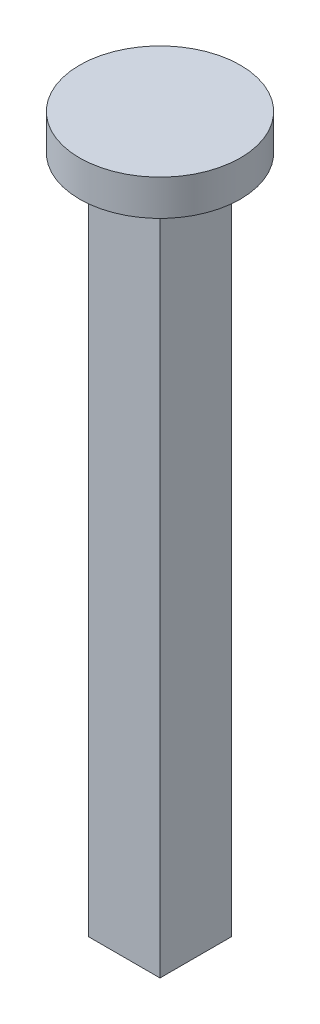
ISO-10303-21;
HEADER;
FILE_DESCRIPTION(('STEP AP214'),'2;1');
FILE_NAME('part.step','',(''),(''),'','','');
FILE_SCHEMA(('AUTOMOTIVE_DESIGN { 1 0 10303 214 1 1 1 1 }'));
ENDSEC;
DATA;
#1=APPLICATION_CONTEXT('core data for automotive mechanical design processes');
#2=APPLICATION_PROTOCOL_DEFINITION('international standard','automotive_design',2000,#1);
#3=PRODUCT_CONTEXT('',#1,'mechanical');
#4=PRODUCT('Part','Part','',(#3));
#5=PRODUCT_RELATED_PRODUCT_CATEGORY('part','',(#4));
#6=PRODUCT_DEFINITION_FORMATION('','',#4);
#7=PRODUCT_DEFINITION_CONTEXT('part definition',#1,'design');
#8=PRODUCT_DEFINITION('design','',#6,#7);
#9=PRODUCT_DEFINITION_SHAPE('','',#8);
#10=(LENGTH_UNIT() NAMED_UNIT(*) SI_UNIT(.MILLI.,.METRE.));
#11=(NAMED_UNIT(*) PLANE_ANGLE_UNIT() SI_UNIT($,.RADIAN.));
#12=(NAMED_UNIT(*) SI_UNIT($,.STERADIAN.) SOLID_ANGLE_UNIT());
#13=UNCERTAINTY_MEASURE_WITH_UNIT(LENGTH_MEASURE(1.E-05),#10,'distance_accuracy_value','');
#14=(GEOMETRIC_REPRESENTATION_CONTEXT(3) GLOBAL_UNCERTAINTY_ASSIGNED_CONTEXT((#13)) GLOBAL_UNIT_ASSIGNED_CONTEXT((#10,
#11,#12)) REPRESENTATION_CONTEXT('',''));
#15=CARTESIAN_POINT('',(0.,0.,0.));
#16=DIRECTION('',(0.,0.,1.));
#17=DIRECTION('',(1.,0.,0.));
#18=AXIS2_PLACEMENT_3D('',#15,#16,#17);
#19=CARTESIAN_POINT('',(-10.,-100.,20.));
#20=DIRECTION('',(1.,0.,0.));
#21=DIRECTION('',(0.,0.,-1.));
#22=AXIS2_PLACEMENT_3D('',#19,#20,#21);
#23=PLANE('',#22);
#24=DIRECTION('',(0.,0.,1.));
#25=VECTOR('',#24,1.);
#26=CARTESIAN_POINT('',(-10.,90.,20.));
#27=LINE('',#26,#25);
#28=CARTESIAN_POINT('',(-10.,90.,0.));
#29=VERTEX_POINT('',#28);
#30=CARTESIAN_POINT('',(-10.,90.,20.));
#31=VERTEX_POINT('',#30);
#32=EDGE_CURVE('E100',#29,#31,#27,.T.);
#33=ORIENTED_EDGE('',*,*,#32,.F.);
#34=DIRECTION('',(0.,-1.,0.));
#35=VECTOR('',#34,1.);
#36=CARTESIAN_POINT('',(-10.,-100.,0.));
#37=LINE('',#36,#35);
#38=CARTESIAN_POINT('',(-10.,-100.,0.));
#39=VERTEX_POINT('',#38);
#40=EDGE_CURVE('E89',#29,#39,#37,.T.);
#41=ORIENTED_EDGE('',*,*,#40,.T.);
#42=DIRECTION('',(0.,0.,-1.));
#43=VECTOR('',#42,1.);
#44=CARTESIAN_POINT('',(-10.,-100.,20.));
#45=LINE('',#44,#43);
#46=CARTESIAN_POINT('',(-10.,-100.,20.));
#47=VERTEX_POINT('',#46);
#48=EDGE_CURVE('E55',#47,#39,#45,.T.);
#49=ORIENTED_EDGE('',*,*,#48,.F.);
#50=DIRECTION('',(0.,-1.,0.));
#51=VECTOR('',#50,1.);
#52=CARTESIAN_POINT('',(-10.,-100.,20.));
#53=LINE('',#52,#51);
#54=EDGE_CURVE('E101',#31,#47,#53,.T.);
#55=ORIENTED_EDGE('',*,*,#54,.F.);
#56=EDGE_LOOP('',(#33,#41,#49,#55));
#57=FACE_BOUND('',#56,.T.);
#58=ADVANCED_FACE('F47',(#57),#23,.F.);
#59=CARTESIAN_POINT('',(10.,-100.,20.));
#60=DIRECTION('',(-1.,0.,0.));
#61=DIRECTION('',(0.,0.,1.));
#62=AXIS2_PLACEMENT_3D('',#59,#60,#61);
#63=PLANE('',#62);
#64=DIRECTION('',(0.,0.,-1.));
#65=VECTOR('',#64,1.);
#66=CARTESIAN_POINT('',(10.,90.,20.));
#67=LINE('',#66,#65);
#68=CARTESIAN_POINT('',(10.,90.,20.));
#69=VERTEX_POINT('',#68);
#70=CARTESIAN_POINT('',(10.,90.,0.));
#71=VERTEX_POINT('',#70);
#72=EDGE_CURVE('E62',#69,#71,#67,.T.);
#73=ORIENTED_EDGE('',*,*,#72,.F.);
#74=DIRECTION('',(0.,1.,0.));
#75=VECTOR('',#74,1.);
#76=CARTESIAN_POINT('',(10.,-100.,20.));
#77=LINE('',#76,#75);
#78=CARTESIAN_POINT('',(10.,-100.,20.));
#79=VERTEX_POINT('',#78);
#80=EDGE_CURVE('E124',#79,#69,#77,.T.);
#81=ORIENTED_EDGE('',*,*,#80,.F.);
#82=DIRECTION('',(0.,0.,-1.));
#83=VECTOR('',#82,1.);
#84=CARTESIAN_POINT('',(10.,-100.,20.));
#85=LINE('',#84,#83);
#86=CARTESIAN_POINT('',(10.,-100.,0.));
#87=VERTEX_POINT('',#86);
#88=EDGE_CURVE('E126',#79,#87,#85,.T.);
#89=ORIENTED_EDGE('',*,*,#88,.T.);
#90=DIRECTION('',(0.,1.,0.));
#91=VECTOR('',#90,1.);
#92=CARTESIAN_POINT('',(10.,-100.,0.));
#93=LINE('',#92,#91);
#94=EDGE_CURVE('E121',#87,#71,#93,.T.);
#95=ORIENTED_EDGE('',*,*,#94,.T.);
#96=EDGE_LOOP('',(#73,#81,#89,#95));
#97=FACE_BOUND('',#96,.T.);
#98=ADVANCED_FACE('F140',(#97),#63,.F.);
#99=CARTESIAN_POINT('',(0.,0.,20.));
#100=DIRECTION('',(0.,0.,1.));
#101=DIRECTION('',(1.,0.,0.));
#102=AXIS2_PLACEMENT_3D('',#99,#100,#101);
#103=PLANE('',#102);
#104=ORIENTED_EDGE('',*,*,#80,.T.);
#105=DIRECTION('',(-1.,0.,0.));
#106=VECTOR('',#105,1.);
#107=CARTESIAN_POINT('',(0.,90.,20.));
#108=LINE('',#107,#106);
#109=EDGE_CURVE('E69',#69,#31,#108,.T.);
#110=ORIENTED_EDGE('',*,*,#109,.T.);
#111=ORIENTED_EDGE('',*,*,#54,.T.);
#112=DIRECTION('',(1.,0.,0.));
#113=VECTOR('',#112,1.);
#114=CARTESIAN_POINT('',(10.,-100.,20.));
#115=LINE('',#114,#113);
#116=EDGE_CURVE('E120',#47,#79,#115,.T.);
#117=ORIENTED_EDGE('',*,*,#116,.T.);
#118=EDGE_LOOP('',(#104,#110,#111,#117));
#119=FACE_BOUND('',#118,.T.);
#120=ADVANCED_FACE('F139',(#119),#103,.T.);
#121=CARTESIAN_POINT('',(0.,0.,0.));
#122=DIRECTION('',(0.,0.,1.));
#123=DIRECTION('',(1.,0.,0.));
#124=AXIS2_PLACEMENT_3D('',#121,#122,#123);
#125=PLANE('',#124);
#126=DIRECTION('',(-1.,0.,0.));
#127=VECTOR('',#126,1.);
#128=CARTESIAN_POINT('',(0.,90.,0.));
#129=LINE('',#128,#127);
#130=EDGE_CURVE('E11',#71,#29,#129,.T.);
#131=ORIENTED_EDGE('',*,*,#130,.F.);
#132=ORIENTED_EDGE('',*,*,#94,.F.);
#133=DIRECTION('',(1.,0.,0.));
#134=VECTOR('',#133,1.);
#135=CARTESIAN_POINT('',(10.,-100.,0.));
#136=LINE('',#135,#134);
#137=EDGE_CURVE('E93',#39,#87,#136,.T.);
#138=ORIENTED_EDGE('',*,*,#137,.F.);
#139=ORIENTED_EDGE('',*,*,#40,.F.);
#140=EDGE_LOOP('',(#131,#132,#138,#139));
#141=FACE_BOUND('',#140,.T.);
#142=ADVANCED_FACE('F91',(#141),#125,.F.);
#143=CARTESIAN_POINT('',(10.,-100.,20.));
#144=DIRECTION('',(0.,1.,0.));
#145=DIRECTION('',(0.,0.,1.));
#146=AXIS2_PLACEMENT_3D('',#143,#144,#145);
#147=PLANE('',#146);
#148=ORIENTED_EDGE('',*,*,#137,.T.);
#149=ORIENTED_EDGE('',*,*,#88,.F.);
#150=ORIENTED_EDGE('',*,*,#116,.F.);
#151=ORIENTED_EDGE('',*,*,#48,.T.);
#152=EDGE_LOOP('',(#148,#149,#150,#151));
#153=FACE_BOUND('',#152,.T.);
#154=ADVANCED_FACE('F137',(#153),#147,.F.);
#155=CARTESIAN_POINT('',(0.,90.,10.));
#156=DIRECTION('',(0.,1.,0.));
#157=DIRECTION('',(0.,0.,1.));
#158=AXIS2_PLACEMENT_3D('',#155,#156,#157);
#159=CYLINDRICAL_SURFACE('',#158,22.5);
#160=CARTESIAN_POINT('',(0.,90.,10.));
#161=DIRECTION('',(0.,1.,0.));
#162=DIRECTION('',(0.,0.,1.));
#163=AXIS2_PLACEMENT_3D('',#160,#161,#162);
#164=CIRCLE('',#163,22.5);
#165=CARTESIAN_POINT('',(0.,90.,32.5));
#166=VERTEX_POINT('',#165);
#167=EDGE_CURVE('E108',#166,#166,#164,.T.);
#168=ORIENTED_EDGE('',*,*,#167,.T.);
#169=EDGE_LOOP('',(#168));
#170=FACE_BOUND('',#169,.T.);
#171=CARTESIAN_POINT('',(0.,100.,10.));
#172=DIRECTION('',(0.,1.,0.));
#173=DIRECTION('',(0.,0.,1.));
#174=AXIS2_PLACEMENT_3D('',#171,#172,#173);
#175=CIRCLE('',#174,22.5);
#176=CARTESIAN_POINT('',(0.,100.,32.5));
#177=VERTEX_POINT('',#176);
#178=EDGE_CURVE('E112',#177,#177,#175,.T.);
#179=ORIENTED_EDGE('',*,*,#178,.F.);
#180=EDGE_LOOP('',(#179));
#181=FACE_BOUND('',#180,.T.);
#182=ADVANCED_FACE('F152',(#170,#181),#159,.T.);
#183=CARTESIAN_POINT('',(0.,90.,10.));
#184=DIRECTION('',(0.,1.,0.));
#185=DIRECTION('',(0.,0.,1.));
#186=AXIS2_PLACEMENT_3D('',#183,#184,#185);
#187=PLANE('',#186);
#188=ORIENTED_EDGE('',*,*,#109,.F.);
#189=ORIENTED_EDGE('',*,*,#72,.T.);
#190=ORIENTED_EDGE('',*,*,#130,.T.);
#191=ORIENTED_EDGE('',*,*,#32,.T.);
#192=EDGE_LOOP('',(#188,#189,#190,#191));
#193=FACE_BOUND('',#192,.T.);
#194=ORIENTED_EDGE('',*,*,#167,.F.);
#195=EDGE_LOOP('',(#194));
#196=FACE_BOUND('',#195,.T.);
#197=ADVANCED_FACE('F105',(#193,#196),#187,.F.);
#198=CARTESIAN_POINT('',(10.,100.,20.));
#199=DIRECTION('',(0.,-1.,0.));
#200=DIRECTION('',(0.,0.,-1.));
#201=AXIS2_PLACEMENT_3D('',#198,#199,#200);
#202=PLANE('',#201);
#203=ORIENTED_EDGE('',*,*,#178,.T.);
#204=EDGE_LOOP('',(#203));
#205=FACE_BOUND('',#204,.T.);
#206=ADVANCED_FACE('F149',(#205),#202,.F.);
#207=CLOSED_SHELL('',(#58,#98,#120,#142,#154,#182,#197,#206));
#208=MANIFOLD_SOLID_BREP('B2',#207);
#209=ADVANCED_BREP_SHAPE_REPRESENTATION('',(#18,#208),#14);
#210=SHAPE_DEFINITION_REPRESENTATION(#9,#209);
ENDSEC;
END-ISO-10303-21;
